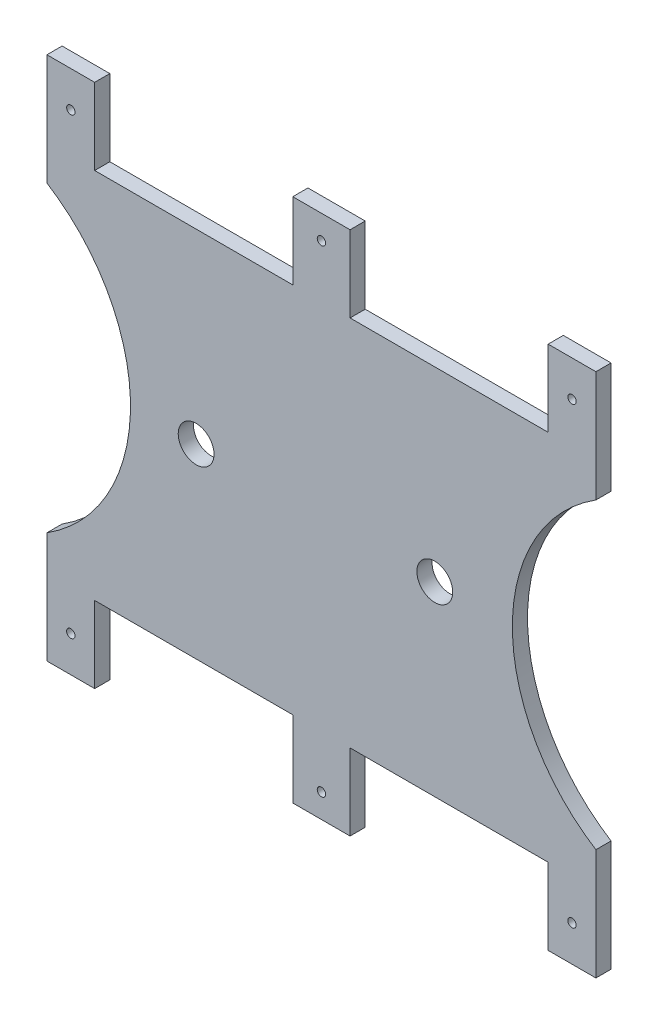
ISO-10303-21;
HEADER;
FILE_DESCRIPTION(('STEP AP214'),'2;1');
FILE_NAME('part.step','',(''),(''),'','','');
FILE_SCHEMA(('AUTOMOTIVE_DESIGN { 1 0 10303 214 1 1 1 1 }'));
ENDSEC;
DATA;
#1=APPLICATION_CONTEXT('core data for automotive mechanical design processes');
#2=APPLICATION_PROTOCOL_DEFINITION('international standard','automotive_design',2000,#1);
#3=PRODUCT_CONTEXT('',#1,'mechanical');
#4=PRODUCT('Part','Part','',(#3));
#5=PRODUCT_RELATED_PRODUCT_CATEGORY('part','',(#4));
#6=PRODUCT_DEFINITION_FORMATION('','',#4);
#7=PRODUCT_DEFINITION_CONTEXT('part definition',#1,'design');
#8=PRODUCT_DEFINITION('design','',#6,#7);
#9=PRODUCT_DEFINITION_SHAPE('','',#8);
#10=(LENGTH_UNIT() NAMED_UNIT(*) SI_UNIT(.MILLI.,.METRE.));
#11=(NAMED_UNIT(*) PLANE_ANGLE_UNIT() SI_UNIT($,.RADIAN.));
#12=(NAMED_UNIT(*) SI_UNIT($,.STERADIAN.) SOLID_ANGLE_UNIT());
#13=UNCERTAINTY_MEASURE_WITH_UNIT(LENGTH_MEASURE(1.E-05),#10,'distance_accuracy_value','');
#14=(GEOMETRIC_REPRESENTATION_CONTEXT(3) GLOBAL_UNCERTAINTY_ASSIGNED_CONTEXT((#13)) GLOBAL_UNIT_ASSIGNED_CONTEXT((#10,
#11,#12)) REPRESENTATION_CONTEXT('',''));
#15=CARTESIAN_POINT('',(0.,0.,0.));
#16=DIRECTION('',(0.,0.,1.));
#17=DIRECTION('',(1.,0.,0.));
#18=AXIS2_PLACEMENT_3D('',#15,#16,#17);
#19=CARTESIAN_POINT('',(-170.,0.,6.35));
#20=DIRECTION('',(0.,0.,1.));
#21=DIRECTION('',(1.,0.,0.));
#22=AXIS2_PLACEMENT_3D('',#19,#20,#21);
#23=PLANE('',#22);
#24=CARTESIAN_POINT('',(-120.,-95.,6.35));
#25=DIRECTION('',(0.,0.,1.));
#26=DIRECTION('',(-1.,0.,0.));
#27=AXIS2_PLACEMENT_3D('',#24,#25,#26);
#28=CIRCLE('',#27,1.75250000000001);
#29=CARTESIAN_POINT('',(-121.7525,-95.,6.35));
#30=VERTEX_POINT('',#29);
#31=EDGE_CURVE('E544',#30,#30,#28,.T.);
#32=ORIENTED_EDGE('',*,*,#31,.F.);
#33=EDGE_LOOP('',(#32));
#34=FACE_BOUND('',#33,.T.);
#35=CARTESIAN_POINT('',(-120.,95.,6.35));
#36=DIRECTION('',(0.,0.,1.));
#37=DIRECTION('',(1.,0.,0.));
#38=AXIS2_PLACEMENT_3D('',#35,#36,#37);
#39=CIRCLE('',#38,1.75250000000001);
#40=CARTESIAN_POINT('',(-118.2475,95.,6.35));
#41=VERTEX_POINT('',#40);
#42=EDGE_CURVE('E560',#41,#41,#39,.T.);
#43=ORIENTED_EDGE('',*,*,#42,.F.);
#44=EDGE_LOOP('',(#43));
#45=FACE_BOUND('',#44,.T.);
#46=CARTESIAN_POINT('',(89.9999999999999,-95.,6.35));
#47=DIRECTION('',(0.,0.,1.));
#48=DIRECTION('',(1.,0.,0.));
#49=AXIS2_PLACEMENT_3D('',#46,#47,#48);
#50=CIRCLE('',#49,1.75250000000001);
#51=CARTESIAN_POINT('',(91.7524999999999,-95.,6.35));
#52=VERTEX_POINT('',#51);
#53=EDGE_CURVE('E576',#52,#52,#50,.T.);
#54=ORIENTED_EDGE('',*,*,#53,.F.);
#55=EDGE_LOOP('',(#54));
#56=FACE_BOUND('',#55,.T.);
#57=CARTESIAN_POINT('',(-67.5,0.,6.35));
#58=DIRECTION('',(0.,0.,1.));
#59=DIRECTION('',(-1.,0.,0.));
#60=AXIS2_PLACEMENT_3D('',#57,#58,#59);
#61=CIRCLE('',#60,7.5);
#62=CARTESIAN_POINT('',(-75.,0.,6.35));
#63=VERTEX_POINT('',#62);
#64=EDGE_CURVE('E246',#63,#63,#61,.T.);
#65=ORIENTED_EDGE('',*,*,#64,.F.);
#66=EDGE_LOOP('',(#65));
#67=FACE_BOUND('',#66,.T.);
#68=DIRECTION('',(0.,-1.,0.));
#69=VECTOR('',#68,1.);
#70=CARTESIAN_POINT('',(-130.,110.,6.35));
#71=LINE('',#70,#69);
#72=CARTESIAN_POINT('',(-130.,110.,6.35));
#73=VERTEX_POINT('',#72);
#74=CARTESIAN_POINT('',(-130.,63.4428877022476,6.35));
#75=VERTEX_POINT('',#74);
#76=EDGE_CURVE('E312',#73,#75,#71,.T.);
#77=ORIENTED_EDGE('',*,*,#76,.T.);
#78=CARTESIAN_POINT('',(-170.,0.,6.35));
#79=DIRECTION('',(0.,0.,-1.));
#80=DIRECTION('',(1.,0.,0.));
#81=AXIS2_PLACEMENT_3D('',#78,#79,#80);
#82=CIRCLE('',#81,75.);
#83=CARTESIAN_POINT('',(-130.,-63.4428877022477,6.35));
#84=VERTEX_POINT('',#83);
#85=EDGE_CURVE('E152',#75,#84,#82,.T.);
#86=ORIENTED_EDGE('',*,*,#85,.T.);
#87=DIRECTION('',(0.,-1.,0.));
#88=VECTOR('',#87,1.);
#89=CARTESIAN_POINT('',(-130.,-63.4428877022477,6.35));
#90=LINE('',#89,#88);
#91=CARTESIAN_POINT('',(-130.,-110.,6.35));
#92=VERTEX_POINT('',#91);
#93=EDGE_CURVE('E397',#84,#92,#90,.T.);
#94=ORIENTED_EDGE('',*,*,#93,.T.);
#95=DIRECTION('',(1.,0.,0.));
#96=VECTOR('',#95,1.);
#97=CARTESIAN_POINT('',(-110.,-110.,6.35));
#98=LINE('',#97,#96);
#99=CARTESIAN_POINT('',(-110.,-110.,6.35));
#100=VERTEX_POINT('',#99);
#101=EDGE_CURVE('E417',#92,#100,#98,.T.);
#102=ORIENTED_EDGE('',*,*,#101,.T.);
#103=DIRECTION('',(0.,1.,0.));
#104=VECTOR('',#103,1.);
#105=CARTESIAN_POINT('',(-110.,-110.,6.35));
#106=LINE('',#105,#104);
#107=CARTESIAN_POINT('',(-110.,-78.,6.35));
#108=VERTEX_POINT('',#107);
#109=EDGE_CURVE('E413',#100,#108,#106,.T.);
#110=ORIENTED_EDGE('',*,*,#109,.T.);
#111=DIRECTION('',(1.,0.,0.));
#112=VECTOR('',#111,1.);
#113=CARTESIAN_POINT('',(-110.,-78.,6.35));
#114=LINE('',#113,#112);
#115=CARTESIAN_POINT('',(-27.,-78.,6.35));
#116=VERTEX_POINT('',#115);
#117=EDGE_CURVE('E416',#108,#116,#114,.T.);
#118=ORIENTED_EDGE('',*,*,#117,.T.);
#119=DIRECTION('',(0.,-1.,0.));
#120=VECTOR('',#119,1.);
#121=CARTESIAN_POINT('',(-27.,-110.,6.35));
#122=LINE('',#121,#120);
#123=CARTESIAN_POINT('',(-27.,-110.,6.35));
#124=VERTEX_POINT('',#123);
#125=EDGE_CURVE('E421',#116,#124,#122,.T.);
#126=ORIENTED_EDGE('',*,*,#125,.T.);
#127=DIRECTION('',(1.,0.,0.));
#128=VECTOR('',#127,1.);
#129=CARTESIAN_POINT('',(-3.00000000000009,-110.,6.35));
#130=LINE('',#129,#128);
#131=CARTESIAN_POINT('',(-3.00000000000009,-110.,6.35));
#132=VERTEX_POINT('',#131);
#133=EDGE_CURVE('E428',#124,#132,#130,.T.);
#134=ORIENTED_EDGE('',*,*,#133,.T.);
#135=DIRECTION('',(0.,1.,0.));
#136=VECTOR('',#135,1.);
#137=CARTESIAN_POINT('',(-3.00000000000009,-110.,6.35));
#138=LINE('',#137,#136);
#139=CARTESIAN_POINT('',(-3.00000000000009,-78.,6.35));
#140=VERTEX_POINT('',#139);
#141=EDGE_CURVE('E431',#132,#140,#138,.T.);
#142=ORIENTED_EDGE('',*,*,#141,.T.);
#143=DIRECTION('',(1.,0.,0.));
#144=VECTOR('',#143,1.);
#145=CARTESIAN_POINT('',(-3.00000000000009,-78.,6.35));
#146=LINE('',#145,#144);
#147=CARTESIAN_POINT('',(79.9999999999999,-78.,6.35));
#148=VERTEX_POINT('',#147);
#149=EDGE_CURVE('E434',#140,#148,#146,.T.);
#150=ORIENTED_EDGE('',*,*,#149,.T.);
#151=DIRECTION('',(0.,-1.,0.));
#152=VECTOR('',#151,1.);
#153=CARTESIAN_POINT('',(79.9999999999999,-110.,6.35));
#154=LINE('',#153,#152);
#155=CARTESIAN_POINT('',(79.9999999999999,-110.,6.35));
#156=VERTEX_POINT('',#155);
#157=EDGE_CURVE('E437',#148,#156,#154,.T.);
#158=ORIENTED_EDGE('',*,*,#157,.T.);
#159=DIRECTION('',(1.,0.,0.));
#160=VECTOR('',#159,1.);
#161=CARTESIAN_POINT('',(100.,-110.,6.35));
#162=LINE('',#161,#160);
#163=CARTESIAN_POINT('',(100.,-110.,6.35));
#164=VERTEX_POINT('',#163);
#165=EDGE_CURVE('E440',#156,#164,#162,.T.);
#166=ORIENTED_EDGE('',*,*,#165,.T.);
#167=DIRECTION('',(0.,1.,0.));
#168=VECTOR('',#167,1.);
#169=CARTESIAN_POINT('',(100.,-63.4428877022476,6.35));
#170=LINE('',#169,#168);
#171=CARTESIAN_POINT('',(100.,-63.4428877022476,6.35));
#172=VERTEX_POINT('',#171);
#173=EDGE_CURVE('E443',#164,#172,#170,.T.);
#174=ORIENTED_EDGE('',*,*,#173,.T.);
#175=CARTESIAN_POINT('',(140.,0.,6.35));
#176=DIRECTION('',(0.,0.,-1.));
#177=DIRECTION('',(-1.,0.,0.));
#178=AXIS2_PLACEMENT_3D('',#175,#176,#177);
#179=CIRCLE('',#178,75.);
#180=CARTESIAN_POINT('',(100.,63.4428877022477,6.35));
#181=VERTEX_POINT('',#180);
#182=EDGE_CURVE('E446',#172,#181,#179,.T.);
#183=ORIENTED_EDGE('',*,*,#182,.T.);
#184=DIRECTION('',(0.,1.,0.));
#185=VECTOR('',#184,1.);
#186=CARTESIAN_POINT('',(100.,110.,6.35));
#187=LINE('',#186,#185);
#188=CARTESIAN_POINT('',(100.,110.,6.35));
#189=VERTEX_POINT('',#188);
#190=EDGE_CURVE('E449',#181,#189,#187,.T.);
#191=ORIENTED_EDGE('',*,*,#190,.T.);
#192=DIRECTION('',(-1.,0.,0.));
#193=VECTOR('',#192,1.);
#194=CARTESIAN_POINT('',(100.,110.,6.35));
#195=LINE('',#194,#193);
#196=CARTESIAN_POINT('',(79.9999999999999,110.,6.35));
#197=VERTEX_POINT('',#196);
#198=EDGE_CURVE('E452',#189,#197,#195,.T.);
#199=ORIENTED_EDGE('',*,*,#198,.T.);
#200=DIRECTION('',(0.,-1.,0.));
#201=VECTOR('',#200,1.);
#202=CARTESIAN_POINT('',(79.9999999999999,110.,6.35));
#203=LINE('',#202,#201);
#204=CARTESIAN_POINT('',(79.9999999999999,78.,6.35));
#205=VERTEX_POINT('',#204);
#206=EDGE_CURVE('E455',#197,#205,#203,.T.);
#207=ORIENTED_EDGE('',*,*,#206,.T.);
#208=DIRECTION('',(-1.,0.,0.));
#209=VECTOR('',#208,1.);
#210=CARTESIAN_POINT('',(-3.00000000000011,78.,6.35));
#211=LINE('',#210,#209);
#212=CARTESIAN_POINT('',(-3.00000000000011,78.,6.35));
#213=VERTEX_POINT('',#212);
#214=EDGE_CURVE('E458',#205,#213,#211,.T.);
#215=ORIENTED_EDGE('',*,*,#214,.T.);
#216=DIRECTION('',(0.,1.,0.));
#217=VECTOR('',#216,1.);
#218=CARTESIAN_POINT('',(-3.00000000000011,110.,6.35));
#219=LINE('',#218,#217);
#220=CARTESIAN_POINT('',(-3.00000000000011,110.,6.35));
#221=VERTEX_POINT('',#220);
#222=EDGE_CURVE('E461',#213,#221,#219,.T.);
#223=ORIENTED_EDGE('',*,*,#222,.T.);
#224=DIRECTION('',(-1.,0.,0.));
#225=VECTOR('',#224,1.);
#226=CARTESIAN_POINT('',(-3.00000000000011,110.,6.35));
#227=LINE('',#226,#225);
#228=CARTESIAN_POINT('',(-27.,110.,6.35));
#229=VERTEX_POINT('',#228);
#230=EDGE_CURVE('E464',#221,#229,#227,.T.);
#231=ORIENTED_EDGE('',*,*,#230,.T.);
#232=DIRECTION('',(0.,-1.,0.));
#233=VECTOR('',#232,1.);
#234=CARTESIAN_POINT('',(-27.,110.,6.35));
#235=LINE('',#234,#233);
#236=CARTESIAN_POINT('',(-27.,78.,6.35));
#237=VERTEX_POINT('',#236);
#238=EDGE_CURVE('E219',#229,#237,#235,.T.);
#239=ORIENTED_EDGE('',*,*,#238,.T.);
#240=DIRECTION('',(-1.,0.,0.));
#241=VECTOR('',#240,1.);
#242=CARTESIAN_POINT('',(-110.,78.,6.35));
#243=LINE('',#242,#241);
#244=CARTESIAN_POINT('',(-110.,78.,6.35));
#245=VERTEX_POINT('',#244);
#246=EDGE_CURVE('E213',#237,#245,#243,.T.);
#247=ORIENTED_EDGE('',*,*,#246,.T.);
#248=DIRECTION('',(0.,1.,0.));
#249=VECTOR('',#248,1.);
#250=CARTESIAN_POINT('',(-110.,110.,6.35));
#251=LINE('',#250,#249);
#252=CARTESIAN_POINT('',(-110.,110.,6.35));
#253=VERTEX_POINT('',#252);
#254=EDGE_CURVE('E217',#245,#253,#251,.T.);
#255=ORIENTED_EDGE('',*,*,#254,.T.);
#256=DIRECTION('',(-1.,0.,0.));
#257=VECTOR('',#256,1.);
#258=CARTESIAN_POINT('',(-110.,110.,6.35));
#259=LINE('',#258,#257);
#260=EDGE_CURVE('E61',#253,#73,#259,.T.);
#261=ORIENTED_EDGE('',*,*,#260,.T.);
#262=EDGE_LOOP('',(#77,#86,#94,#102,#110,#118,#126,#134,#142,#150,#158,#166,#174,#183,#191,#199,
#207,#215,#223,#231,#239,#247,#255,#261));
#263=FACE_BOUND('',#262,.T.);
#264=CARTESIAN_POINT('',(-15.,-100.,6.35));
#265=DIRECTION('',(0.,0.,1.));
#266=DIRECTION('',(-1.,0.,0.));
#267=AXIS2_PLACEMENT_3D('',#264,#265,#266);
#268=CIRCLE('',#267,1.75250000000001);
#269=CARTESIAN_POINT('',(-16.7525,-100.,6.35));
#270=VERTEX_POINT('',#269);
#271=EDGE_CURVE('E584',#270,#270,#268,.T.);
#272=ORIENTED_EDGE('',*,*,#271,.F.);
#273=EDGE_LOOP('',(#272));
#274=FACE_BOUND('',#273,.T.);
#275=CARTESIAN_POINT('',(32.5,0.,6.35));
#276=DIRECTION('',(0.,0.,1.));
#277=DIRECTION('',(1.,0.,0.));
#278=AXIS2_PLACEMENT_3D('',#275,#276,#277);
#279=CIRCLE('',#278,7.5);
#280=CARTESIAN_POINT('',(40.,0.,6.35));
#281=VERTEX_POINT('',#280);
#282=EDGE_CURVE('E568',#281,#281,#279,.T.);
#283=ORIENTED_EDGE('',*,*,#282,.F.);
#284=EDGE_LOOP('',(#283));
#285=FACE_BOUND('',#284,.T.);
#286=CARTESIAN_POINT('',(89.9999999999999,95.,6.35));
#287=DIRECTION('',(0.,0.,1.));
#288=DIRECTION('',(-1.,0.,0.));
#289=AXIS2_PLACEMENT_3D('',#286,#287,#288);
#290=CIRCLE('',#289,1.75250000000001);
#291=CARTESIAN_POINT('',(88.2474999999999,95.,6.35));
#292=VERTEX_POINT('',#291);
#293=EDGE_CURVE('E552',#292,#292,#290,.T.);
#294=ORIENTED_EDGE('',*,*,#293,.F.);
#295=EDGE_LOOP('',(#294));
#296=FACE_BOUND('',#295,.T.);
#297=CARTESIAN_POINT('',(-15.,100.,6.35));
#298=DIRECTION('',(0.,0.,1.));
#299=DIRECTION('',(1.,0.,0.));
#300=AXIS2_PLACEMENT_3D('',#297,#298,#299);
#301=CIRCLE('',#300,1.75250000000001);
#302=CARTESIAN_POINT('',(-13.2475,100.,6.35));
#303=VERTEX_POINT('',#302);
#304=EDGE_CURVE('E533',#303,#303,#301,.T.);
#305=ORIENTED_EDGE('',*,*,#304,.F.);
#306=EDGE_LOOP('',(#305));
#307=FACE_BOUND('',#306,.T.);
#308=ADVANCED_FACE('F43',(#34,#45,#56,#67,#263,#274,#285,#296,#307),#23,.T.);
#309=CARTESIAN_POINT('',(-170.,0.,0.));
#310=DIRECTION('',(0.,0.,1.));
#311=DIRECTION('',(1.,0.,0.));
#312=AXIS2_PLACEMENT_3D('',#309,#310,#311);
#313=PLANE('',#312);
#314=DIRECTION('',(0.,-1.,0.));
#315=VECTOR('',#314,1.);
#316=CARTESIAN_POINT('',(-130.,110.,0.));
#317=LINE('',#316,#315);
#318=CARTESIAN_POINT('',(-130.,110.,0.));
#319=VERTEX_POINT('',#318);
#320=CARTESIAN_POINT('',(-130.,63.4428877022476,0.));
#321=VERTEX_POINT('',#320);
#322=EDGE_CURVE('E241',#319,#321,#317,.T.);
#323=ORIENTED_EDGE('',*,*,#322,.F.);
#324=DIRECTION('',(-1.,0.,0.));
#325=VECTOR('',#324,1.);
#326=CARTESIAN_POINT('',(-110.,110.,0.));
#327=LINE('',#326,#325);
#328=CARTESIAN_POINT('',(-110.,110.,0.));
#329=VERTEX_POINT('',#328);
#330=EDGE_CURVE('E144',#329,#319,#327,.T.);
#331=ORIENTED_EDGE('',*,*,#330,.F.);
#332=DIRECTION('',(0.,1.,0.));
#333=VECTOR('',#332,1.);
#334=CARTESIAN_POINT('',(-110.,110.,0.));
#335=LINE('',#334,#333);
#336=CARTESIAN_POINT('',(-110.,78.,0.));
#337=VERTEX_POINT('',#336);
#338=EDGE_CURVE('E138',#337,#329,#335,.T.);
#339=ORIENTED_EDGE('',*,*,#338,.F.);
#340=DIRECTION('',(-1.,0.,0.));
#341=VECTOR('',#340,1.);
#342=CARTESIAN_POINT('',(-110.,78.,0.));
#343=LINE('',#342,#341);
#344=CARTESIAN_POINT('',(-27.,78.,0.));
#345=VERTEX_POINT('',#344);
#346=EDGE_CURVE('E228',#345,#337,#343,.T.);
#347=ORIENTED_EDGE('',*,*,#346,.F.);
#348=DIRECTION('',(0.,-1.,0.));
#349=VECTOR('',#348,1.);
#350=CARTESIAN_POINT('',(-27.,110.,0.));
#351=LINE('',#350,#349);
#352=CARTESIAN_POINT('',(-27.,110.,0.));
#353=VERTEX_POINT('',#352);
#354=EDGE_CURVE('E303',#353,#345,#351,.T.);
#355=ORIENTED_EDGE('',*,*,#354,.F.);
#356=DIRECTION('',(-1.,0.,0.));
#357=VECTOR('',#356,1.);
#358=CARTESIAN_POINT('',(-3.00000000000011,110.,0.));
#359=LINE('',#358,#357);
#360=CARTESIAN_POINT('',(-3.00000000000011,110.,0.));
#361=VERTEX_POINT('',#360);
#362=EDGE_CURVE('E300',#361,#353,#359,.T.);
#363=ORIENTED_EDGE('',*,*,#362,.F.);
#364=DIRECTION('',(0.,1.,0.));
#365=VECTOR('',#364,1.);
#366=CARTESIAN_POINT('',(-3.00000000000011,110.,0.));
#367=LINE('',#366,#365);
#368=CARTESIAN_POINT('',(-3.00000000000011,78.,0.));
#369=VERTEX_POINT('',#368);
#370=EDGE_CURVE('E297',#369,#361,#367,.T.);
#371=ORIENTED_EDGE('',*,*,#370,.F.);
#372=DIRECTION('',(-1.,0.,0.));
#373=VECTOR('',#372,1.);
#374=CARTESIAN_POINT('',(-3.00000000000011,78.,0.));
#375=LINE('',#374,#373);
#376=CARTESIAN_POINT('',(79.9999999999999,78.,0.));
#377=VERTEX_POINT('',#376);
#378=EDGE_CURVE('E294',#377,#369,#375,.T.);
#379=ORIENTED_EDGE('',*,*,#378,.F.);
#380=DIRECTION('',(0.,-1.,0.));
#381=VECTOR('',#380,1.);
#382=CARTESIAN_POINT('',(79.9999999999999,110.,0.));
#383=LINE('',#382,#381);
#384=CARTESIAN_POINT('',(79.9999999999999,110.,0.));
#385=VERTEX_POINT('',#384);
#386=EDGE_CURVE('E291',#385,#377,#383,.T.);
#387=ORIENTED_EDGE('',*,*,#386,.F.);
#388=DIRECTION('',(-1.,0.,0.));
#389=VECTOR('',#388,1.);
#390=CARTESIAN_POINT('',(100.,110.,0.));
#391=LINE('',#390,#389);
#392=CARTESIAN_POINT('',(100.,110.,0.));
#393=VERTEX_POINT('',#392);
#394=EDGE_CURVE('E288',#393,#385,#391,.T.);
#395=ORIENTED_EDGE('',*,*,#394,.F.);
#396=DIRECTION('',(0.,1.,0.));
#397=VECTOR('',#396,1.);
#398=CARTESIAN_POINT('',(100.,110.,0.));
#399=LINE('',#398,#397);
#400=CARTESIAN_POINT('',(100.,63.4428877022477,0.));
#401=VERTEX_POINT('',#400);
#402=EDGE_CURVE('E285',#401,#393,#399,.T.);
#403=ORIENTED_EDGE('',*,*,#402,.F.);
#404=CARTESIAN_POINT('',(140.,0.,0.));
#405=DIRECTION('',(0.,0.,-1.));
#406=DIRECTION('',(-1.,0.,0.));
#407=AXIS2_PLACEMENT_3D('',#404,#405,#406);
#408=CIRCLE('',#407,75.);
#409=CARTESIAN_POINT('',(100.,-63.4428877022476,0.));
#410=VERTEX_POINT('',#409);
#411=EDGE_CURVE('E282',#410,#401,#408,.T.);
#412=ORIENTED_EDGE('',*,*,#411,.F.);
#413=DIRECTION('',(0.,1.,0.));
#414=VECTOR('',#413,1.);
#415=CARTESIAN_POINT('',(100.,-63.4428877022476,0.));
#416=LINE('',#415,#414);
#417=CARTESIAN_POINT('',(100.,-110.,0.));
#418=VERTEX_POINT('',#417);
#419=EDGE_CURVE('E279',#418,#410,#416,.T.);
#420=ORIENTED_EDGE('',*,*,#419,.F.);
#421=DIRECTION('',(1.,0.,0.));
#422=VECTOR('',#421,1.);
#423=CARTESIAN_POINT('',(100.,-110.,0.));
#424=LINE('',#423,#422);
#425=CARTESIAN_POINT('',(79.9999999999999,-110.,0.));
#426=VERTEX_POINT('',#425);
#427=EDGE_CURVE('E276',#426,#418,#424,.T.);
#428=ORIENTED_EDGE('',*,*,#427,.F.);
#429=DIRECTION('',(0.,-1.,0.));
#430=VECTOR('',#429,1.);
#431=CARTESIAN_POINT('',(79.9999999999999,-110.,0.));
#432=LINE('',#431,#430);
#433=CARTESIAN_POINT('',(79.9999999999999,-78.,0.));
#434=VERTEX_POINT('',#433);
#435=EDGE_CURVE('E273',#434,#426,#432,.T.);
#436=ORIENTED_EDGE('',*,*,#435,.F.);
#437=DIRECTION('',(1.,0.,0.));
#438=VECTOR('',#437,1.);
#439=CARTESIAN_POINT('',(-3.00000000000009,-78.,0.));
#440=LINE('',#439,#438);
#441=CARTESIAN_POINT('',(-3.00000000000009,-78.,0.));
#442=VERTEX_POINT('',#441);
#443=EDGE_CURVE('E270',#442,#434,#440,.T.);
#444=ORIENTED_EDGE('',*,*,#443,.F.);
#445=DIRECTION('',(0.,1.,0.));
#446=VECTOR('',#445,1.);
#447=CARTESIAN_POINT('',(-3.00000000000009,-110.,0.));
#448=LINE('',#447,#446);
#449=CARTESIAN_POINT('',(-3.00000000000009,-110.,0.));
#450=VERTEX_POINT('',#449);
#451=EDGE_CURVE('E267',#450,#442,#448,.T.);
#452=ORIENTED_EDGE('',*,*,#451,.F.);
#453=DIRECTION('',(1.,0.,0.));
#454=VECTOR('',#453,1.);
#455=CARTESIAN_POINT('',(-3.00000000000009,-110.,0.));
#456=LINE('',#455,#454);
#457=CARTESIAN_POINT('',(-27.,-110.,0.));
#458=VERTEX_POINT('',#457);
#459=EDGE_CURVE('E264',#458,#450,#456,.T.);
#460=ORIENTED_EDGE('',*,*,#459,.F.);
#461=DIRECTION('',(0.,-1.,0.));
#462=VECTOR('',#461,1.);
#463=CARTESIAN_POINT('',(-27.,-110.,0.));
#464=LINE('',#463,#462);
#465=CARTESIAN_POINT('',(-27.,-78.,0.));
#466=VERTEX_POINT('',#465);
#467=EDGE_CURVE('E261',#466,#458,#464,.T.);
#468=ORIENTED_EDGE('',*,*,#467,.F.);
#469=DIRECTION('',(1.,0.,0.));
#470=VECTOR('',#469,1.);
#471=CARTESIAN_POINT('',(-110.,-78.,0.));
#472=LINE('',#471,#470);
#473=CARTESIAN_POINT('',(-110.,-78.,0.));
#474=VERTEX_POINT('',#473);
#475=EDGE_CURVE('E258',#474,#466,#472,.T.);
#476=ORIENTED_EDGE('',*,*,#475,.F.);
#477=DIRECTION('',(0.,1.,0.));
#478=VECTOR('',#477,1.);
#479=CARTESIAN_POINT('',(-110.,-110.,0.));
#480=LINE('',#479,#478);
#481=CARTESIAN_POINT('',(-110.,-110.,0.));
#482=VERTEX_POINT('',#481);
#483=EDGE_CURVE('E255',#482,#474,#480,.T.);
#484=ORIENTED_EDGE('',*,*,#483,.F.);
#485=DIRECTION('',(1.,0.,0.));
#486=VECTOR('',#485,1.);
#487=CARTESIAN_POINT('',(-110.,-110.,0.));
#488=LINE('',#487,#486);
#489=CARTESIAN_POINT('',(-130.,-110.,0.));
#490=VERTEX_POINT('',#489);
#491=EDGE_CURVE('E252',#490,#482,#488,.T.);
#492=ORIENTED_EDGE('',*,*,#491,.F.);
#493=DIRECTION('',(0.,-1.,0.));
#494=VECTOR('',#493,1.);
#495=CARTESIAN_POINT('',(-130.,-63.4428877022477,0.));
#496=LINE('',#495,#494);
#497=CARTESIAN_POINT('',(-130.,-63.4428877022477,0.));
#498=VERTEX_POINT('',#497);
#499=EDGE_CURVE('E249',#498,#490,#496,.T.);
#500=ORIENTED_EDGE('',*,*,#499,.F.);
#501=CARTESIAN_POINT('',(-170.,0.,0.));
#502=DIRECTION('',(0.,0.,-1.));
#503=DIRECTION('',(1.,0.,0.));
#504=AXIS2_PLACEMENT_3D('',#501,#502,#503);
#505=CIRCLE('',#504,75.);
#506=EDGE_CURVE('E245',#321,#498,#505,.T.);
#507=ORIENTED_EDGE('',*,*,#506,.F.);
#508=EDGE_LOOP('',(#323,#331,#339,#347,#355,#363,#371,#379,#387,#395,#403,#412,#420,#428,#436,
#444,#452,#460,#468,#476,#484,#492,#500,#507));
#509=FACE_BOUND('',#508,.T.);
#510=CARTESIAN_POINT('',(-67.5,0.,0.));
#511=DIRECTION('',(0.,0.,1.));
#512=DIRECTION('',(-1.,0.,0.));
#513=AXIS2_PLACEMENT_3D('',#510,#511,#512);
#514=CIRCLE('',#513,7.5);
#515=CARTESIAN_POINT('',(-75.,0.,0.));
#516=VERTEX_POINT('',#515);
#517=EDGE_CURVE('E588',#516,#516,#514,.T.);
#518=ORIENTED_EDGE('',*,*,#517,.T.);
#519=EDGE_LOOP('',(#518));
#520=FACE_BOUND('',#519,.T.);
#521=CARTESIAN_POINT('',(-15.,-100.,0.));
#522=DIRECTION('',(0.,0.,1.));
#523=DIRECTION('',(-1.,0.,0.));
#524=AXIS2_PLACEMENT_3D('',#521,#522,#523);
#525=CIRCLE('',#524,1.75250000000001);
#526=CARTESIAN_POINT('',(-16.7525,-100.,0.));
#527=VERTEX_POINT('',#526);
#528=EDGE_CURVE('E580',#527,#527,#525,.T.);
#529=ORIENTED_EDGE('',*,*,#528,.T.);
#530=EDGE_LOOP('',(#529));
#531=FACE_BOUND('',#530,.T.);
#532=CARTESIAN_POINT('',(89.9999999999999,-95.,0.));
#533=DIRECTION('',(0.,0.,1.));
#534=DIRECTION('',(1.,0.,0.));
#535=AXIS2_PLACEMENT_3D('',#532,#533,#534);
#536=CIRCLE('',#535,1.75250000000001);
#537=CARTESIAN_POINT('',(91.7524999999999,-95.,0.));
#538=VERTEX_POINT('',#537);
#539=EDGE_CURVE('E572',#538,#538,#536,.T.);
#540=ORIENTED_EDGE('',*,*,#539,.T.);
#541=EDGE_LOOP('',(#540));
#542=FACE_BOUND('',#541,.T.);
#543=CARTESIAN_POINT('',(32.5,0.,0.));
#544=DIRECTION('',(0.,0.,1.));
#545=DIRECTION('',(1.,0.,0.));
#546=AXIS2_PLACEMENT_3D('',#543,#544,#545);
#547=CIRCLE('',#546,7.5);
#548=CARTESIAN_POINT('',(40.,0.,0.));
#549=VERTEX_POINT('',#548);
#550=EDGE_CURVE('E564',#549,#549,#547,.T.);
#551=ORIENTED_EDGE('',*,*,#550,.T.);
#552=EDGE_LOOP('',(#551));
#553=FACE_BOUND('',#552,.T.);
#554=CARTESIAN_POINT('',(-120.,95.,0.));
#555=DIRECTION('',(0.,0.,1.));
#556=DIRECTION('',(1.,0.,0.));
#557=AXIS2_PLACEMENT_3D('',#554,#555,#556);
#558=CIRCLE('',#557,1.75250000000001);
#559=CARTESIAN_POINT('',(-118.2475,95.,0.));
#560=VERTEX_POINT('',#559);
#561=EDGE_CURVE('E556',#560,#560,#558,.T.);
#562=ORIENTED_EDGE('',*,*,#561,.T.);
#563=EDGE_LOOP('',(#562));
#564=FACE_BOUND('',#563,.T.);
#565=CARTESIAN_POINT('',(89.9999999999999,95.,0.));
#566=DIRECTION('',(0.,0.,1.));
#567=DIRECTION('',(-1.,0.,0.));
#568=AXIS2_PLACEMENT_3D('',#565,#566,#567);
#569=CIRCLE('',#568,1.75250000000001);
#570=CARTESIAN_POINT('',(88.2474999999999,95.,0.));
#571=VERTEX_POINT('',#570);
#572=EDGE_CURVE('E548',#571,#571,#569,.T.);
#573=ORIENTED_EDGE('',*,*,#572,.T.);
#574=EDGE_LOOP('',(#573));
#575=FACE_BOUND('',#574,.T.);
#576=CARTESIAN_POINT('',(-120.,-95.,0.));
#577=DIRECTION('',(0.,0.,1.));
#578=DIRECTION('',(-1.,0.,0.));
#579=AXIS2_PLACEMENT_3D('',#576,#577,#578);
#580=CIRCLE('',#579,1.75250000000001);
#581=CARTESIAN_POINT('',(-121.7525,-95.,0.));
#582=VERTEX_POINT('',#581);
#583=EDGE_CURVE('E541',#582,#582,#580,.T.);
#584=ORIENTED_EDGE('',*,*,#583,.T.);
#585=EDGE_LOOP('',(#584));
#586=FACE_BOUND('',#585,.T.);
#587=CARTESIAN_POINT('',(-15.,100.,0.));
#588=DIRECTION('',(0.,0.,1.));
#589=DIRECTION('',(1.,0.,0.));
#590=AXIS2_PLACEMENT_3D('',#587,#588,#589);
#591=CIRCLE('',#590,1.75250000000001);
#592=CARTESIAN_POINT('',(-13.2475,100.,0.));
#593=VERTEX_POINT('',#592);
#594=EDGE_CURVE('E536',#593,#593,#591,.T.);
#595=ORIENTED_EDGE('',*,*,#594,.T.);
#596=EDGE_LOOP('',(#595));
#597=FACE_BOUND('',#596,.T.);
#598=ADVANCED_FACE('F401',(#509,#520,#531,#542,#553,#564,#575,#586,#597),#313,.F.);
#599=CARTESIAN_POINT('',(-130.,110.,6.35));
#600=DIRECTION('',(1.,0.,0.));
#601=DIRECTION('',(0.,0.,-1.));
#602=AXIS2_PLACEMENT_3D('',#599,#600,#601);
#603=PLANE('',#602);
#604=ORIENTED_EDGE('',*,*,#322,.T.);
#605=DIRECTION('',(0.,0.,-1.));
#606=VECTOR('',#605,1.);
#607=CARTESIAN_POINT('',(-130.,63.4428877022476,6.35));
#608=LINE('',#607,#606);
#609=EDGE_CURVE('E11',#75,#321,#608,.T.);
#610=ORIENTED_EDGE('',*,*,#609,.F.);
#611=ORIENTED_EDGE('',*,*,#76,.F.);
#612=DIRECTION('',(0.,0.,-1.));
#613=VECTOR('',#612,1.);
#614=CARTESIAN_POINT('',(-130.,110.,6.35));
#615=LINE('',#614,#613);
#616=EDGE_CURVE('E237',#73,#319,#615,.T.);
#617=ORIENTED_EDGE('',*,*,#616,.T.);
#618=EDGE_LOOP('',(#604,#610,#611,#617));
#619=FACE_BOUND('',#618,.T.);
#620=ADVANCED_FACE('F45',(#619),#603,.F.);
#621=CARTESIAN_POINT('',(-170.,0.,6.35));
#622=DIRECTION('',(0.,0.,-1.));
#623=DIRECTION('',(-1.,0.,0.));
#624=AXIS2_PLACEMENT_3D('',#621,#622,#623);
#625=CYLINDRICAL_SURFACE('',#624,75.);
#626=ORIENTED_EDGE('',*,*,#506,.T.);
#627=DIRECTION('',(0.,0.,-1.));
#628=VECTOR('',#627,1.);
#629=CARTESIAN_POINT('',(-130.,-63.4428877022477,6.35));
#630=LINE('',#629,#628);
#631=EDGE_CURVE('E53',#84,#498,#630,.T.);
#632=ORIENTED_EDGE('',*,*,#631,.F.);
#633=ORIENTED_EDGE('',*,*,#85,.F.);
#634=ORIENTED_EDGE('',*,*,#609,.T.);
#635=EDGE_LOOP('',(#626,#632,#633,#634));
#636=FACE_BOUND('',#635,.T.);
#637=ADVANCED_FACE('F882',(#636),#625,.F.);
#638=CARTESIAN_POINT('',(-130.,-63.4428877022477,6.35));
#639=DIRECTION('',(1.,0.,0.));
#640=DIRECTION('',(0.,1.,0.));
#641=AXIS2_PLACEMENT_3D('',#638,#639,#640);
#642=PLANE('',#641);
#643=ORIENTED_EDGE('',*,*,#499,.T.);
#644=DIRECTION('',(0.,0.,-1.));
#645=VECTOR('',#644,1.);
#646=CARTESIAN_POINT('',(-130.,-110.,6.35));
#647=LINE('',#646,#645);
#648=EDGE_CURVE('E387',#92,#490,#647,.T.);
#649=ORIENTED_EDGE('',*,*,#648,.F.);
#650=ORIENTED_EDGE('',*,*,#93,.F.);
#651=ORIENTED_EDGE('',*,*,#631,.T.);
#652=EDGE_LOOP('',(#643,#649,#650,#651));
#653=FACE_BOUND('',#652,.T.);
#654=ADVANCED_FACE('F395',(#653),#642,.F.);
#655=CARTESIAN_POINT('',(-110.,-110.,6.35));
#656=DIRECTION('',(0.,1.,0.));
#657=DIRECTION('',(-1.,0.,0.));
#658=AXIS2_PLACEMENT_3D('',#655,#656,#657);
#659=PLANE('',#658);
#660=ORIENTED_EDGE('',*,*,#491,.T.);
#661=DIRECTION('',(0.,0.,-1.));
#662=VECTOR('',#661,1.);
#663=CARTESIAN_POINT('',(-110.,-110.,6.35));
#664=LINE('',#663,#662);
#665=EDGE_CURVE('E383',#100,#482,#664,.T.);
#666=ORIENTED_EDGE('',*,*,#665,.F.);
#667=ORIENTED_EDGE('',*,*,#101,.F.);
#668=ORIENTED_EDGE('',*,*,#648,.T.);
#669=EDGE_LOOP('',(#660,#666,#667,#668));
#670=FACE_BOUND('',#669,.T.);
#671=ADVANCED_FACE('F407',(#670),#659,.F.);
#672=CARTESIAN_POINT('',(-110.,-110.,6.35));
#673=DIRECTION('',(-1.,0.,0.));
#674=DIRECTION('',(0.,-1.,0.));
#675=AXIS2_PLACEMENT_3D('',#672,#673,#674);
#676=PLANE('',#675);
#677=ORIENTED_EDGE('',*,*,#483,.T.);
#678=DIRECTION('',(0.,0.,-1.));
#679=VECTOR('',#678,1.);
#680=CARTESIAN_POINT('',(-110.,-78.,6.35));
#681=LINE('',#680,#679);
#682=EDGE_CURVE('E379',#108,#474,#681,.T.);
#683=ORIENTED_EDGE('',*,*,#682,.F.);
#684=ORIENTED_EDGE('',*,*,#109,.F.);
#685=ORIENTED_EDGE('',*,*,#665,.T.);
#686=EDGE_LOOP('',(#677,#683,#684,#685));
#687=FACE_BOUND('',#686,.T.);
#688=ADVANCED_FACE('F411',(#687),#676,.F.);
#689=CARTESIAN_POINT('',(-110.,-78.,6.35));
#690=DIRECTION('',(0.,1.,0.));
#691=DIRECTION('',(-1.,0.,0.));
#692=AXIS2_PLACEMENT_3D('',#689,#690,#691);
#693=PLANE('',#692);
#694=ORIENTED_EDGE('',*,*,#475,.T.);
#695=DIRECTION('',(0.,0.,-1.));
#696=VECTOR('',#695,1.);
#697=CARTESIAN_POINT('',(-27.,-78.,6.35));
#698=LINE('',#697,#696);
#699=EDGE_CURVE('E375',#116,#466,#698,.T.);
#700=ORIENTED_EDGE('',*,*,#699,.F.);
#701=ORIENTED_EDGE('',*,*,#117,.F.);
#702=ORIENTED_EDGE('',*,*,#682,.T.);
#703=EDGE_LOOP('',(#694,#700,#701,#702));
#704=FACE_BOUND('',#703,.T.);
#705=ADVANCED_FACE('F843',(#704),#693,.F.);
#706=CARTESIAN_POINT('',(-27.,-110.,6.35));
#707=DIRECTION('',(1.,0.,0.));
#708=DIRECTION('',(0.,1.,0.));
#709=AXIS2_PLACEMENT_3D('',#706,#707,#708);
#710=PLANE('',#709);
#711=ORIENTED_EDGE('',*,*,#467,.T.);
#712=DIRECTION('',(0.,0.,-1.));
#713=VECTOR('',#712,1.);
#714=CARTESIAN_POINT('',(-27.,-110.,6.35));
#715=LINE('',#714,#713);
#716=EDGE_CURVE('E371',#124,#458,#715,.T.);
#717=ORIENTED_EDGE('',*,*,#716,.F.);
#718=ORIENTED_EDGE('',*,*,#125,.F.);
#719=ORIENTED_EDGE('',*,*,#699,.T.);
#720=EDGE_LOOP('',(#711,#717,#718,#719));
#721=FACE_BOUND('',#720,.T.);
#722=ADVANCED_FACE('F832',(#721),#710,.F.);
#723=CARTESIAN_POINT('',(-3.00000000000009,-110.,6.35));
#724=DIRECTION('',(0.,1.,0.));
#725=DIRECTION('',(0.,0.,1.));
#726=AXIS2_PLACEMENT_3D('',#723,#724,#725);
#727=PLANE('',#726);
#728=ORIENTED_EDGE('',*,*,#459,.T.);
#729=DIRECTION('',(0.,0.,-1.));
#730=VECTOR('',#729,1.);
#731=CARTESIAN_POINT('',(-3.00000000000009,-110.,6.35));
#732=LINE('',#731,#730);
#733=EDGE_CURVE('E367',#132,#450,#732,.T.);
#734=ORIENTED_EDGE('',*,*,#733,.F.);
#735=ORIENTED_EDGE('',*,*,#133,.F.);
#736=ORIENTED_EDGE('',*,*,#716,.T.);
#737=EDGE_LOOP('',(#728,#734,#735,#736));
#738=FACE_BOUND('',#737,.T.);
#739=ADVANCED_FACE('F821',(#738),#727,.F.);
#740=CARTESIAN_POINT('',(-3.00000000000009,-110.,6.35));
#741=DIRECTION('',(-1.,0.,0.));
#742=DIRECTION('',(0.,-1.,0.));
#743=AXIS2_PLACEMENT_3D('',#740,#741,#742);
#744=PLANE('',#743);
#745=ORIENTED_EDGE('',*,*,#451,.T.);
#746=DIRECTION('',(0.,0.,-1.));
#747=VECTOR('',#746,1.);
#748=CARTESIAN_POINT('',(-3.00000000000009,-78.,6.35));
#749=LINE('',#748,#747);
#750=EDGE_CURVE('E363',#140,#442,#749,.T.);
#751=ORIENTED_EDGE('',*,*,#750,.F.);
#752=ORIENTED_EDGE('',*,*,#141,.F.);
#753=ORIENTED_EDGE('',*,*,#733,.T.);
#754=EDGE_LOOP('',(#745,#751,#752,#753));
#755=FACE_BOUND('',#754,.T.);
#756=ADVANCED_FACE('F810',(#755),#744,.F.);
#757=CARTESIAN_POINT('',(-3.00000000000009,-78.,6.35));
#758=DIRECTION('',(0.,1.,0.));
#759=DIRECTION('',(-1.,0.,0.));
#760=AXIS2_PLACEMENT_3D('',#757,#758,#759);
#761=PLANE('',#760);
#762=ORIENTED_EDGE('',*,*,#443,.T.);
#763=DIRECTION('',(0.,0.,-1.));
#764=VECTOR('',#763,1.);
#765=CARTESIAN_POINT('',(79.9999999999999,-78.,6.35));
#766=LINE('',#765,#764);
#767=EDGE_CURVE('E359',#148,#434,#766,.T.);
#768=ORIENTED_EDGE('',*,*,#767,.F.);
#769=ORIENTED_EDGE('',*,*,#149,.F.);
#770=ORIENTED_EDGE('',*,*,#750,.T.);
#771=EDGE_LOOP('',(#762,#768,#769,#770));
#772=FACE_BOUND('',#771,.T.);
#773=ADVANCED_FACE('F799',(#772),#761,.F.);
#774=CARTESIAN_POINT('',(79.9999999999999,-110.,6.35));
#775=DIRECTION('',(1.,0.,0.));
#776=DIRECTION('',(0.,1.,0.));
#777=AXIS2_PLACEMENT_3D('',#774,#775,#776);
#778=PLANE('',#777);
#779=ORIENTED_EDGE('',*,*,#435,.T.);
#780=DIRECTION('',(0.,0.,-1.));
#781=VECTOR('',#780,1.);
#782=CARTESIAN_POINT('',(79.9999999999999,-110.,6.35));
#783=LINE('',#782,#781);
#784=EDGE_CURVE('E355',#156,#426,#783,.T.);
#785=ORIENTED_EDGE('',*,*,#784,.F.);
#786=ORIENTED_EDGE('',*,*,#157,.F.);
#787=ORIENTED_EDGE('',*,*,#767,.T.);
#788=EDGE_LOOP('',(#779,#785,#786,#787));
#789=FACE_BOUND('',#788,.T.);
#790=ADVANCED_FACE('F788',(#789),#778,.F.);
#791=CARTESIAN_POINT('',(100.,-110.,6.35));
#792=DIRECTION('',(0.,1.,0.));
#793=DIRECTION('',(0.,0.,1.));
#794=AXIS2_PLACEMENT_3D('',#791,#792,#793);
#795=PLANE('',#794);
#796=ORIENTED_EDGE('',*,*,#427,.T.);
#797=DIRECTION('',(0.,0.,-1.));
#798=VECTOR('',#797,1.);
#799=CARTESIAN_POINT('',(100.,-110.,6.35));
#800=LINE('',#799,#798);
#801=EDGE_CURVE('E351',#164,#418,#800,.T.);
#802=ORIENTED_EDGE('',*,*,#801,.F.);
#803=ORIENTED_EDGE('',*,*,#165,.F.);
#804=ORIENTED_EDGE('',*,*,#784,.T.);
#805=EDGE_LOOP('',(#796,#802,#803,#804));
#806=FACE_BOUND('',#805,.T.);
#807=ADVANCED_FACE('F777',(#806),#795,.F.);
#808=CARTESIAN_POINT('',(100.,-63.4428877022476,6.35));
#809=DIRECTION('',(-1.,0.,0.));
#810=DIRECTION('',(0.,0.,1.));
#811=AXIS2_PLACEMENT_3D('',#808,#809,#810);
#812=PLANE('',#811);
#813=ORIENTED_EDGE('',*,*,#419,.T.);
#814=DIRECTION('',(0.,0.,-1.));
#815=VECTOR('',#814,1.);
#816=CARTESIAN_POINT('',(100.,-63.4428877022476,6.35));
#817=LINE('',#816,#815);
#818=EDGE_CURVE('E347',#172,#410,#817,.T.);
#819=ORIENTED_EDGE('',*,*,#818,.F.);
#820=ORIENTED_EDGE('',*,*,#173,.F.);
#821=ORIENTED_EDGE('',*,*,#801,.T.);
#822=EDGE_LOOP('',(#813,#819,#820,#821));
#823=FACE_BOUND('',#822,.T.);
#824=ADVANCED_FACE('F766',(#823),#812,.F.);
#825=CARTESIAN_POINT('',(140.,0.,6.35));
#826=DIRECTION('',(0.,0.,-1.));
#827=DIRECTION('',(-1.,0.,0.));
#828=AXIS2_PLACEMENT_3D('',#825,#826,#827);
#829=CYLINDRICAL_SURFACE('',#828,75.);
#830=ORIENTED_EDGE('',*,*,#411,.T.);
#831=DIRECTION('',(0.,0.,-1.));
#832=VECTOR('',#831,1.);
#833=CARTESIAN_POINT('',(100.,63.4428877022477,6.35));
#834=LINE('',#833,#832);
#835=EDGE_CURVE('E343',#181,#401,#834,.T.);
#836=ORIENTED_EDGE('',*,*,#835,.F.);
#837=ORIENTED_EDGE('',*,*,#182,.F.);
#838=ORIENTED_EDGE('',*,*,#818,.T.);
#839=EDGE_LOOP('',(#830,#836,#837,#838));
#840=FACE_BOUND('',#839,.T.);
#841=ADVANCED_FACE('F755',(#840),#829,.F.);
#842=CARTESIAN_POINT('',(100.,110.,6.35));
#843=DIRECTION('',(-1.,0.,0.));
#844=DIRECTION('',(0.,0.,1.));
#845=AXIS2_PLACEMENT_3D('',#842,#843,#844);
#846=PLANE('',#845);
#847=ORIENTED_EDGE('',*,*,#402,.T.);
#848=DIRECTION('',(0.,0.,-1.));
#849=VECTOR('',#848,1.);
#850=CARTESIAN_POINT('',(100.,110.,6.35));
#851=LINE('',#850,#849);
#852=EDGE_CURVE('E339',#189,#393,#851,.T.);
#853=ORIENTED_EDGE('',*,*,#852,.F.);
#854=ORIENTED_EDGE('',*,*,#190,.F.);
#855=ORIENTED_EDGE('',*,*,#835,.T.);
#856=EDGE_LOOP('',(#847,#853,#854,#855));
#857=FACE_BOUND('',#856,.T.);
#858=ADVANCED_FACE('F744',(#857),#846,.F.);
#859=CARTESIAN_POINT('',(100.,110.,6.35));
#860=DIRECTION('',(0.,-1.,0.));
#861=DIRECTION('',(0.,0.,-1.));
#862=AXIS2_PLACEMENT_3D('',#859,#860,#861);
#863=PLANE('',#862);
#864=ORIENTED_EDGE('',*,*,#394,.T.);
#865=DIRECTION('',(0.,0.,-1.));
#866=VECTOR('',#865,1.);
#867=CARTESIAN_POINT('',(79.9999999999999,110.,6.35));
#868=LINE('',#867,#866);
#869=EDGE_CURVE('E335',#197,#385,#868,.T.);
#870=ORIENTED_EDGE('',*,*,#869,.F.);
#871=ORIENTED_EDGE('',*,*,#198,.F.);
#872=ORIENTED_EDGE('',*,*,#852,.T.);
#873=EDGE_LOOP('',(#864,#870,#871,#872));
#874=FACE_BOUND('',#873,.T.);
#875=ADVANCED_FACE('F733',(#874),#863,.F.);
#876=CARTESIAN_POINT('',(79.9999999999999,110.,6.35));
#877=DIRECTION('',(1.,0.,0.));
#878=DIRECTION('',(0.,0.,-1.));
#879=AXIS2_PLACEMENT_3D('',#876,#877,#878);
#880=PLANE('',#879);
#881=ORIENTED_EDGE('',*,*,#386,.T.);
#882=DIRECTION('',(0.,0.,-1.));
#883=VECTOR('',#882,1.);
#884=CARTESIAN_POINT('',(79.9999999999999,78.,6.35));
#885=LINE('',#884,#883);
#886=EDGE_CURVE('E331',#205,#377,#885,.T.);
#887=ORIENTED_EDGE('',*,*,#886,.F.);
#888=ORIENTED_EDGE('',*,*,#206,.F.);
#889=ORIENTED_EDGE('',*,*,#869,.T.);
#890=EDGE_LOOP('',(#881,#887,#888,#889));
#891=FACE_BOUND('',#890,.T.);
#892=ADVANCED_FACE('F722',(#891),#880,.F.);
#893=CARTESIAN_POINT('',(-3.00000000000011,78.,6.35));
#894=DIRECTION('',(0.,-1.,0.));
#895=DIRECTION('',(0.,0.,-1.));
#896=AXIS2_PLACEMENT_3D('',#893,#894,#895);
#897=PLANE('',#896);
#898=ORIENTED_EDGE('',*,*,#378,.T.);
#899=DIRECTION('',(0.,0.,-1.));
#900=VECTOR('',#899,1.);
#901=CARTESIAN_POINT('',(-3.00000000000011,78.,6.35));
#902=LINE('',#901,#900);
#903=EDGE_CURVE('E327',#213,#369,#902,.T.);
#904=ORIENTED_EDGE('',*,*,#903,.F.);
#905=ORIENTED_EDGE('',*,*,#214,.F.);
#906=ORIENTED_EDGE('',*,*,#886,.T.);
#907=EDGE_LOOP('',(#898,#904,#905,#906));
#908=FACE_BOUND('',#907,.T.);
#909=ADVANCED_FACE('F711',(#908),#897,.F.);
#910=CARTESIAN_POINT('',(-3.00000000000011,110.,6.35));
#911=DIRECTION('',(-1.,0.,0.));
#912=DIRECTION('',(0.,-1.,0.));
#913=AXIS2_PLACEMENT_3D('',#910,#911,#912);
#914=PLANE('',#913);
#915=ORIENTED_EDGE('',*,*,#370,.T.);
#916=DIRECTION('',(0.,0.,-1.));
#917=VECTOR('',#916,1.);
#918=CARTESIAN_POINT('',(-3.00000000000011,110.,6.35));
#919=LINE('',#918,#917);
#920=EDGE_CURVE('E323',#221,#361,#919,.T.);
#921=ORIENTED_EDGE('',*,*,#920,.F.);
#922=ORIENTED_EDGE('',*,*,#222,.F.);
#923=ORIENTED_EDGE('',*,*,#903,.T.);
#924=EDGE_LOOP('',(#915,#921,#922,#923));
#925=FACE_BOUND('',#924,.T.);
#926=ADVANCED_FACE('F701',(#925),#914,.F.);
#927=CARTESIAN_POINT('',(-3.00000000000011,110.,6.35));
#928=DIRECTION('',(0.,-1.,0.));
#929=DIRECTION('',(0.,0.,-1.));
#930=AXIS2_PLACEMENT_3D('',#927,#928,#929);
#931=PLANE('',#930);
#932=ORIENTED_EDGE('',*,*,#362,.T.);
#933=DIRECTION('',(0.,0.,-1.));
#934=VECTOR('',#933,1.);
#935=CARTESIAN_POINT('',(-27.,110.,6.35));
#936=LINE('',#935,#934);
#937=EDGE_CURVE('E319',#229,#353,#936,.T.);
#938=ORIENTED_EDGE('',*,*,#937,.F.);
#939=ORIENTED_EDGE('',*,*,#230,.F.);
#940=ORIENTED_EDGE('',*,*,#920,.T.);
#941=EDGE_LOOP('',(#932,#938,#939,#940));
#942=FACE_BOUND('',#941,.T.);
#943=ADVANCED_FACE('F472',(#942),#931,.F.);
#944=CARTESIAN_POINT('',(-27.,110.,6.35));
#945=DIRECTION('',(1.,0.,0.));
#946=DIRECTION('',(0.,1.,0.));
#947=AXIS2_PLACEMENT_3D('',#944,#945,#946);
#948=PLANE('',#947);
#949=ORIENTED_EDGE('',*,*,#354,.T.);
#950=DIRECTION('',(0.,0.,-1.));
#951=VECTOR('',#950,1.);
#952=CARTESIAN_POINT('',(-27.,78.,6.35));
#953=LINE('',#952,#951);
#954=EDGE_CURVE('E230',#237,#345,#953,.T.);
#955=ORIENTED_EDGE('',*,*,#954,.F.);
#956=ORIENTED_EDGE('',*,*,#238,.F.);
#957=ORIENTED_EDGE('',*,*,#937,.T.);
#958=EDGE_LOOP('',(#949,#955,#956,#957));
#959=FACE_BOUND('',#958,.T.);
#960=ADVANCED_FACE('F476',(#959),#948,.F.);
#961=CARTESIAN_POINT('',(-110.,78.,6.35));
#962=DIRECTION('',(0.,-1.,0.));
#963=DIRECTION('',(0.,0.,-1.));
#964=AXIS2_PLACEMENT_3D('',#961,#962,#963);
#965=PLANE('',#964);
#966=ORIENTED_EDGE('',*,*,#346,.T.);
#967=DIRECTION('',(0.,0.,-1.));
#968=VECTOR('',#967,1.);
#969=CARTESIAN_POINT('',(-110.,78.,6.35));
#970=LINE('',#969,#968);
#971=EDGE_CURVE('E225',#245,#337,#970,.T.);
#972=ORIENTED_EDGE('',*,*,#971,.F.);
#973=ORIENTED_EDGE('',*,*,#246,.F.);
#974=ORIENTED_EDGE('',*,*,#954,.T.);
#975=EDGE_LOOP('',(#966,#972,#973,#974));
#976=FACE_BOUND('',#975,.T.);
#977=ADVANCED_FACE('F226',(#976),#965,.F.);
#978=CARTESIAN_POINT('',(-110.,110.,6.35));
#979=DIRECTION('',(-1.,0.,0.));
#980=DIRECTION('',(0.,-1.,0.));
#981=AXIS2_PLACEMENT_3D('',#978,#979,#980);
#982=PLANE('',#981);
#983=ORIENTED_EDGE('',*,*,#338,.T.);
#984=DIRECTION('',(0.,0.,-1.));
#985=VECTOR('',#984,1.);
#986=CARTESIAN_POINT('',(-110.,110.,6.35));
#987=LINE('',#986,#985);
#988=EDGE_CURVE('E231',#253,#329,#987,.T.);
#989=ORIENTED_EDGE('',*,*,#988,.F.);
#990=ORIENTED_EDGE('',*,*,#254,.F.);
#991=ORIENTED_EDGE('',*,*,#971,.T.);
#992=EDGE_LOOP('',(#983,#989,#990,#991));
#993=FACE_BOUND('',#992,.T.);
#994=ADVANCED_FACE('F233',(#993),#982,.F.);
#995=CARTESIAN_POINT('',(-110.,110.,6.35));
#996=DIRECTION('',(0.,-1.,0.));
#997=DIRECTION('',(1.,0.,0.));
#998=AXIS2_PLACEMENT_3D('',#995,#996,#997);
#999=PLANE('',#998);
#1000=ORIENTED_EDGE('',*,*,#330,.T.);
#1001=ORIENTED_EDGE('',*,*,#616,.F.);
#1002=ORIENTED_EDGE('',*,*,#260,.F.);
#1003=ORIENTED_EDGE('',*,*,#988,.T.);
#1004=EDGE_LOOP('',(#1000,#1001,#1002,#1003));
#1005=FACE_BOUND('',#1004,.T.);
#1006=ADVANCED_FACE('F480',(#1005),#999,.F.);
#1007=CARTESIAN_POINT('',(-67.5,0.,6.35));
#1008=DIRECTION('',(0.,0.,-1.));
#1009=DIRECTION('',(-1.,0.,0.));
#1010=AXIS2_PLACEMENT_3D('',#1007,#1008,#1009);
#1011=CYLINDRICAL_SURFACE('',#1010,7.5);
#1012=ORIENTED_EDGE('',*,*,#64,.T.);
#1013=EDGE_LOOP('',(#1012));
#1014=FACE_BOUND('',#1013,.T.);
#1015=ORIENTED_EDGE('',*,*,#517,.F.);
#1016=EDGE_LOOP('',(#1015));
#1017=FACE_BOUND('',#1016,.T.);
#1018=ADVANCED_FACE('F482',(#1014,#1017),#1011,.F.);
#1019=CARTESIAN_POINT('',(-15.,-100.,6.35));
#1020=DIRECTION('',(0.,0.,-1.));
#1021=DIRECTION('',(-1.,0.,0.));
#1022=AXIS2_PLACEMENT_3D('',#1019,#1020,#1021);
#1023=CYLINDRICAL_SURFACE('',#1022,1.75250000000001);
#1024=ORIENTED_EDGE('',*,*,#271,.T.);
#1025=EDGE_LOOP('',(#1024));
#1026=FACE_BOUND('',#1025,.T.);
#1027=ORIENTED_EDGE('',*,*,#528,.F.);
#1028=EDGE_LOOP('',(#1027));
#1029=FACE_BOUND('',#1028,.T.);
#1030=ADVANCED_FACE('F488',(#1026,#1029),#1023,.F.);
#1031=CARTESIAN_POINT('',(89.9999999999999,-95.,6.35));
#1032=DIRECTION('',(0.,0.,-1.));
#1033=DIRECTION('',(-1.,0.,0.));
#1034=AXIS2_PLACEMENT_3D('',#1031,#1032,#1033);
#1035=CYLINDRICAL_SURFACE('',#1034,1.75250000000001);
#1036=ORIENTED_EDGE('',*,*,#53,.T.);
#1037=EDGE_LOOP('',(#1036));
#1038=FACE_BOUND('',#1037,.T.);
#1039=ORIENTED_EDGE('',*,*,#539,.F.);
#1040=EDGE_LOOP('',(#1039));
#1041=FACE_BOUND('',#1040,.T.);
#1042=ADVANCED_FACE('F504',(#1038,#1041),#1035,.F.);
#1043=CARTESIAN_POINT('',(32.5,0.,6.35));
#1044=DIRECTION('',(0.,0.,-1.));
#1045=DIRECTION('',(-1.,0.,0.));
#1046=AXIS2_PLACEMENT_3D('',#1043,#1044,#1045);
#1047=CYLINDRICAL_SURFACE('',#1046,7.5);
#1048=ORIENTED_EDGE('',*,*,#282,.T.);
#1049=EDGE_LOOP('',(#1048));
#1050=FACE_BOUND('',#1049,.T.);
#1051=ORIENTED_EDGE('',*,*,#550,.F.);
#1052=EDGE_LOOP('',(#1051));
#1053=FACE_BOUND('',#1052,.T.);
#1054=ADVANCED_FACE('F508',(#1050,#1053),#1047,.F.);
#1055=CARTESIAN_POINT('',(-120.,95.,6.35));
#1056=DIRECTION('',(0.,0.,-1.));
#1057=DIRECTION('',(-1.,0.,0.));
#1058=AXIS2_PLACEMENT_3D('',#1055,#1056,#1057);
#1059=CYLINDRICAL_SURFACE('',#1058,1.75250000000001);
#1060=ORIENTED_EDGE('',*,*,#42,.T.);
#1061=EDGE_LOOP('',(#1060));
#1062=FACE_BOUND('',#1061,.T.);
#1063=ORIENTED_EDGE('',*,*,#561,.F.);
#1064=EDGE_LOOP('',(#1063));
#1065=FACE_BOUND('',#1064,.T.);
#1066=ADVANCED_FACE('F512',(#1062,#1065),#1059,.F.);
#1067=CARTESIAN_POINT('',(89.9999999999999,95.,6.35));
#1068=DIRECTION('',(0.,0.,-1.));
#1069=DIRECTION('',(-1.,0.,0.));
#1070=AXIS2_PLACEMENT_3D('',#1067,#1068,#1069);
#1071=CYLINDRICAL_SURFACE('',#1070,1.75250000000001);
#1072=ORIENTED_EDGE('',*,*,#293,.T.);
#1073=EDGE_LOOP('',(#1072));
#1074=FACE_BOUND('',#1073,.T.);
#1075=ORIENTED_EDGE('',*,*,#572,.F.);
#1076=EDGE_LOOP('',(#1075));
#1077=FACE_BOUND('',#1076,.T.);
#1078=ADVANCED_FACE('F516',(#1074,#1077),#1071,.F.);
#1079=CARTESIAN_POINT('',(-120.,-95.,6.35));
#1080=DIRECTION('',(0.,0.,-1.));
#1081=DIRECTION('',(-1.,0.,0.));
#1082=AXIS2_PLACEMENT_3D('',#1079,#1080,#1081);
#1083=CYLINDRICAL_SURFACE('',#1082,1.75250000000001);
#1084=ORIENTED_EDGE('',*,*,#31,.T.);
#1085=EDGE_LOOP('',(#1084));
#1086=FACE_BOUND('',#1085,.T.);
#1087=ORIENTED_EDGE('',*,*,#583,.F.);
#1088=EDGE_LOOP('',(#1087));
#1089=FACE_BOUND('',#1088,.T.);
#1090=ADVANCED_FACE('F520',(#1086,#1089),#1083,.F.);
#1091=CARTESIAN_POINT('',(-15.,100.,6.35));
#1092=DIRECTION('',(0.,0.,-1.));
#1093=DIRECTION('',(-1.,0.,0.));
#1094=AXIS2_PLACEMENT_3D('',#1091,#1092,#1093);
#1095=CYLINDRICAL_SURFACE('',#1094,1.75250000000001);
#1096=ORIENTED_EDGE('',*,*,#304,.T.);
#1097=EDGE_LOOP('',(#1096));
#1098=FACE_BOUND('',#1097,.T.);
#1099=ORIENTED_EDGE('',*,*,#594,.F.);
#1100=EDGE_LOOP('',(#1099));
#1101=FACE_BOUND('',#1100,.T.);
#1102=ADVANCED_FACE('F524',(#1098,#1101),#1095,.F.);
#1103=CLOSED_SHELL('',(#308,#598,#620,#637,#654,#671,#688,#705,#722,#739,#756,#773,#790,#807,
#824,#841,#858,#875,#892,#909,#926,#943,#960,#977,#994,#1006,#1018,#1030,#1042,#1054,#1066,
#1078,#1090,#1102));
#1104=MANIFOLD_SOLID_BREP('B2',#1103);
#1105=ADVANCED_BREP_SHAPE_REPRESENTATION('',(#18,#1104),#14);
#1106=SHAPE_DEFINITION_REPRESENTATION(#9,#1105);
ENDSEC;
END-ISO-10303-21;
